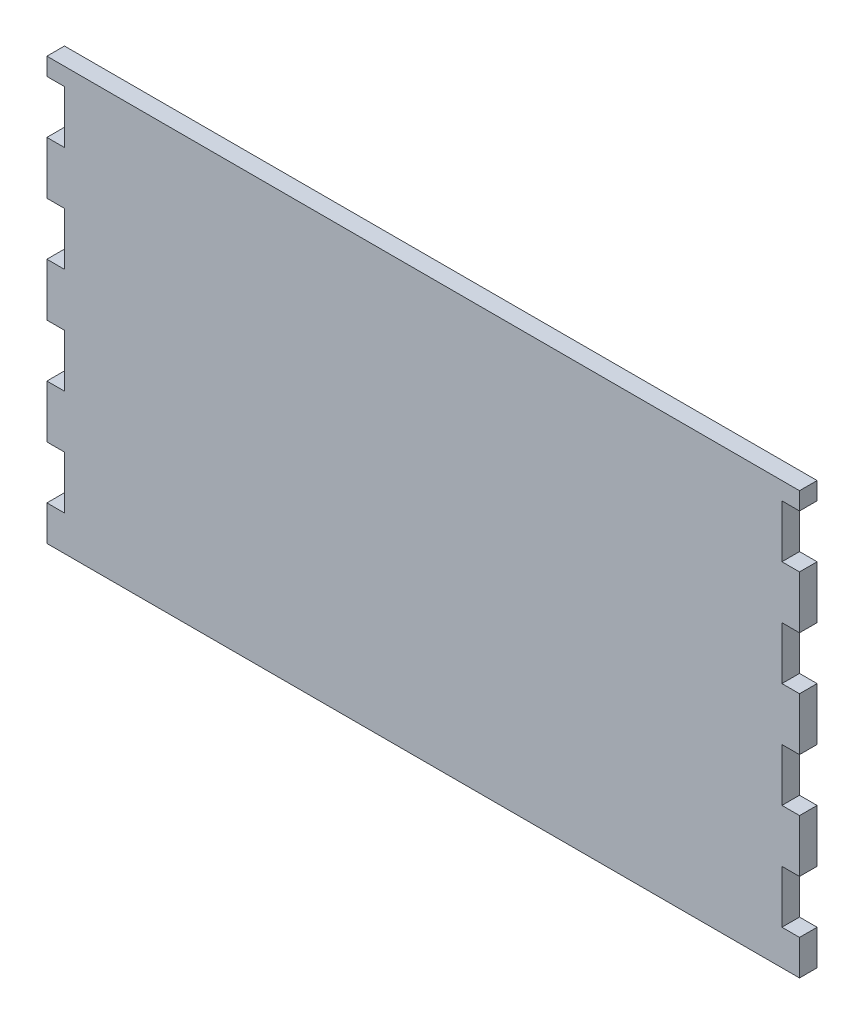
ISO-10303-21;
HEADER;
FILE_DESCRIPTION(('STEP AP214'),'2;1');
FILE_NAME('part.step','',(''),(''),'','','');
FILE_SCHEMA(('AUTOMOTIVE_DESIGN { 1 0 10303 214 1 1 1 1 }'));
ENDSEC;
DATA;
#1=APPLICATION_CONTEXT('core data for automotive mechanical design processes');
#2=APPLICATION_PROTOCOL_DEFINITION('international standard','automotive_design',2000,#1);
#3=PRODUCT_CONTEXT('',#1,'mechanical');
#4=PRODUCT('Part','Part','',(#3));
#5=PRODUCT_RELATED_PRODUCT_CATEGORY('part','',(#4));
#6=PRODUCT_DEFINITION_FORMATION('','',#4);
#7=PRODUCT_DEFINITION_CONTEXT('part definition',#1,'design');
#8=PRODUCT_DEFINITION('design','',#6,#7);
#9=PRODUCT_DEFINITION_SHAPE('','',#8);
#10=(LENGTH_UNIT() NAMED_UNIT(*) SI_UNIT(.MILLI.,.METRE.));
#11=(NAMED_UNIT(*) PLANE_ANGLE_UNIT() SI_UNIT($,.RADIAN.));
#12=(NAMED_UNIT(*) SI_UNIT($,.STERADIAN.) SOLID_ANGLE_UNIT());
#13=UNCERTAINTY_MEASURE_WITH_UNIT(LENGTH_MEASURE(1.E-05),#10,'distance_accuracy_value','');
#14=(GEOMETRIC_REPRESENTATION_CONTEXT(3) GLOBAL_UNCERTAINTY_ASSIGNED_CONTEXT((#13)) GLOBAL_UNIT_ASSIGNED_CONTEXT((#10,
#11,#12)) REPRESENTATION_CONTEXT('',''));
#15=CARTESIAN_POINT('',(0.,0.,0.));
#16=DIRECTION('',(0.,0.,1.));
#17=DIRECTION('',(1.,0.,0.));
#18=AXIS2_PLACEMENT_3D('',#15,#16,#17);
#19=CARTESIAN_POINT('',(135.889999999999,-76.1999999999998,6.35));
#20=DIRECTION('',(-1.,0.,0.));
#21=DIRECTION('',(0.,0.,1.));
#22=AXIS2_PLACEMENT_3D('',#19,#20,#21);
#23=PLANE('',#22);
#24=DIRECTION('',(0.,0.,1.));
#25=VECTOR('',#24,1.);
#26=CARTESIAN_POINT('',(135.890000000001,50.8000000000002,0.));
#27=LINE('',#26,#25);
#28=CARTESIAN_POINT('',(135.890000000001,50.8000000000002,0.));
#29=VERTEX_POINT('',#28);
#30=CARTESIAN_POINT('',(135.890000000001,50.8000000000002,6.35));
#31=VERTEX_POINT('',#30);
#32=EDGE_CURVE('E466',#29,#31,#27,.T.);
#33=ORIENTED_EDGE('',*,*,#32,.T.);
#34=DIRECTION('',(0.,1.,0.));
#35=VECTOR('',#34,1.);
#36=CARTESIAN_POINT('',(135.889999999999,-76.1999999999998,6.35));
#37=LINE('',#36,#35);
#38=CARTESIAN_POINT('',(135.890000000001,31.7500000000002,6.35));
#39=VERTEX_POINT('',#38);
#40=EDGE_CURVE('E606',#39,#31,#37,.T.);
#41=ORIENTED_EDGE('',*,*,#40,.F.);
#42=DIRECTION('',(0.,0.,1.));
#43=VECTOR('',#42,1.);
#44=CARTESIAN_POINT('',(135.890000000001,31.7500000000002,0.));
#45=LINE('',#44,#43);
#46=CARTESIAN_POINT('',(135.890000000001,31.7500000000002,0.));
#47=VERTEX_POINT('',#46);
#48=EDGE_CURVE('E330',#47,#39,#45,.T.);
#49=ORIENTED_EDGE('',*,*,#48,.F.);
#50=DIRECTION('',(0.,1.,0.));
#51=VECTOR('',#50,1.);
#52=CARTESIAN_POINT('',(135.889999999999,-76.1999999999998,0.));
#53=LINE('',#52,#51);
#54=EDGE_CURVE('E289',#47,#29,#53,.T.);
#55=ORIENTED_EDGE('',*,*,#54,.T.);
#56=EDGE_LOOP('',(#33,#41,#49,#55));
#57=FACE_BOUND('',#56,.T.);
#58=ADVANCED_FACE('F33',(#57),#23,.F.);
#59=DIRECTION('',(0.,0.,1.));
#60=VECTOR('',#59,1.);
#61=CARTESIAN_POINT('',(135.890000000001,69.8500000000002,0.));
#62=LINE('',#61,#60);
#63=CARTESIAN_POINT('',(135.890000000001,69.8500000000002,0.));
#64=VERTEX_POINT('',#63);
#65=CARTESIAN_POINT('',(135.890000000001,69.8500000000002,6.35));
#66=VERTEX_POINT('',#65);
#67=EDGE_CURVE('E267',#64,#66,#62,.T.);
#68=ORIENTED_EDGE('',*,*,#67,.F.);
#69=CARTESIAN_POINT('',(135.889999999999,76.2000000000002,0.));
#70=VERTEX_POINT('',#69);
#71=EDGE_CURVE('E279',#64,#70,#53,.T.);
#72=ORIENTED_EDGE('',*,*,#71,.T.);
#73=DIRECTION('',(0.,0.,-1.));
#74=VECTOR('',#73,1.);
#75=CARTESIAN_POINT('',(135.889999999999,76.2000000000002,6.35));
#76=LINE('',#75,#74);
#77=CARTESIAN_POINT('',(135.889999999999,76.2000000000002,6.35));
#78=VERTEX_POINT('',#77);
#79=EDGE_CURVE('E612',#78,#70,#76,.T.);
#80=ORIENTED_EDGE('',*,*,#79,.F.);
#81=EDGE_CURVE('E281',#66,#78,#37,.T.);
#82=ORIENTED_EDGE('',*,*,#81,.F.);
#83=EDGE_LOOP('',(#68,#72,#80,#82));
#84=FACE_BOUND('',#83,.T.);
#85=ADVANCED_FACE('F277',(#84),#23,.F.);
#86=DIRECTION('',(0.,0.,1.));
#87=VECTOR('',#86,1.);
#88=CARTESIAN_POINT('',(135.890000000001,12.7000000000002,0.));
#89=LINE('',#88,#87);
#90=CARTESIAN_POINT('',(135.890000000001,12.7000000000002,0.));
#91=VERTEX_POINT('',#90);
#92=CARTESIAN_POINT('',(135.890000000001,12.7000000000002,6.35));
#93=VERTEX_POINT('',#92);
#94=EDGE_CURVE('E317',#91,#93,#89,.T.);
#95=ORIENTED_EDGE('',*,*,#94,.T.);
#96=CARTESIAN_POINT('',(135.890000000001,-6.3499999999998,6.35));
#97=VERTEX_POINT('',#96);
#98=EDGE_CURVE('E605',#97,#93,#37,.T.);
#99=ORIENTED_EDGE('',*,*,#98,.F.);
#100=DIRECTION('',(0.,0.,1.));
#101=VECTOR('',#100,1.);
#102=CARTESIAN_POINT('',(135.890000000001,-6.3499999999998,0.));
#103=LINE('',#102,#101);
#104=CARTESIAN_POINT('',(135.890000000001,-6.3499999999998,0.));
#105=VERTEX_POINT('',#104);
#106=EDGE_CURVE('E319',#105,#97,#103,.T.);
#107=ORIENTED_EDGE('',*,*,#106,.F.);
#108=EDGE_CURVE('E294',#105,#91,#53,.T.);
#109=ORIENTED_EDGE('',*,*,#108,.T.);
#110=EDGE_LOOP('',(#95,#99,#107,#109));
#111=FACE_BOUND('',#110,.T.);
#112=ADVANCED_FACE('F315',(#111),#23,.F.);
#113=DIRECTION('',(0.,0.,1.));
#114=VECTOR('',#113,1.);
#115=CARTESIAN_POINT('',(135.890000000001,-25.3999999999998,0.));
#116=LINE('',#115,#114);
#117=CARTESIAN_POINT('',(135.890000000001,-25.3999999999998,0.));
#118=VERTEX_POINT('',#117);
#119=CARTESIAN_POINT('',(135.890000000001,-25.3999999999998,6.35));
#120=VERTEX_POINT('',#119);
#121=EDGE_CURVE('E341',#118,#120,#116,.T.);
#122=ORIENTED_EDGE('',*,*,#121,.T.);
#123=CARTESIAN_POINT('',(135.890000000001,-44.4499999999998,6.35));
#124=VERTEX_POINT('',#123);
#125=EDGE_CURVE('E513',#124,#120,#37,.T.);
#126=ORIENTED_EDGE('',*,*,#125,.F.);
#127=DIRECTION('',(0.,0.,1.));
#128=VECTOR('',#127,1.);
#129=CARTESIAN_POINT('',(135.890000000001,-44.4499999999998,0.));
#130=LINE('',#129,#128);
#131=CARTESIAN_POINT('',(135.890000000001,-44.4499999999998,0.));
#132=VERTEX_POINT('',#131);
#133=EDGE_CURVE('E382',#132,#124,#130,.T.);
#134=ORIENTED_EDGE('',*,*,#133,.F.);
#135=EDGE_CURVE('E299',#132,#118,#53,.T.);
#136=ORIENTED_EDGE('',*,*,#135,.T.);
#137=EDGE_LOOP('',(#122,#126,#134,#136));
#138=FACE_BOUND('',#137,.T.);
#139=ADVANCED_FACE('F585',(#138),#23,.F.);
#140=DIRECTION('',(0.,0.,1.));
#141=VECTOR('',#140,1.);
#142=CARTESIAN_POINT('',(135.890000000001,-63.4999999999998,0.));
#143=LINE('',#142,#141);
#144=CARTESIAN_POINT('',(135.890000000001,-63.4999999999998,0.));
#145=VERTEX_POINT('',#144);
#146=CARTESIAN_POINT('',(135.890000000001,-63.4999999999998,6.35));
#147=VERTEX_POINT('',#146);
#148=EDGE_CURVE('E363',#145,#147,#143,.T.);
#149=ORIENTED_EDGE('',*,*,#148,.T.);
#150=CARTESIAN_POINT('',(135.889999999999,-76.1999999999998,6.35));
#151=VERTEX_POINT('',#150);
#152=EDGE_CURVE('E509',#151,#147,#37,.T.);
#153=ORIENTED_EDGE('',*,*,#152,.F.);
#154=DIRECTION('',(0.,0.,-1.));
#155=VECTOR('',#154,1.);
#156=CARTESIAN_POINT('',(135.889999999999,-76.1999999999998,6.35));
#157=LINE('',#156,#155);
#158=CARTESIAN_POINT('',(135.889999999999,-76.1999999999998,0.));
#159=VERTEX_POINT('',#158);
#160=EDGE_CURVE('E41',#151,#159,#157,.T.);
#161=ORIENTED_EDGE('',*,*,#160,.T.);
#162=EDGE_CURVE('E292',#159,#145,#53,.T.);
#163=ORIENTED_EDGE('',*,*,#162,.T.);
#164=EDGE_LOOP('',(#149,#153,#161,#163));
#165=FACE_BOUND('',#164,.T.);
#166=ADVANCED_FACE('F578',(#165),#23,.F.);
#167=CARTESIAN_POINT('',(0.,0.,6.35));
#168=DIRECTION('',(0.,0.,1.));
#169=DIRECTION('',(1.,0.,0.));
#170=AXIS2_PLACEMENT_3D('',#167,#168,#169);
#171=PLANE('',#170);
#172=ORIENTED_EDGE('',*,*,#40,.T.);
#173=DIRECTION('',(-1.,0.,0.));
#174=VECTOR('',#173,1.);
#175=CARTESIAN_POINT('',(135.890000000001,50.8000000000002,6.35));
#176=LINE('',#175,#174);
#177=CARTESIAN_POINT('',(129.540000000001,50.8000000000002,6.35));
#178=VERTEX_POINT('',#177);
#179=EDGE_CURVE('E273',#31,#178,#176,.T.);
#180=ORIENTED_EDGE('',*,*,#179,.T.);
#181=DIRECTION('',(0.,1.,0.));
#182=VECTOR('',#181,1.);
#183=CARTESIAN_POINT('',(129.540000000001,69.8500000000002,6.35));
#184=LINE('',#183,#182);
#185=CARTESIAN_POINT('',(129.540000000001,69.8500000000002,6.35));
#186=VERTEX_POINT('',#185);
#187=EDGE_CURVE('E888',#178,#186,#184,.T.);
#188=ORIENTED_EDGE('',*,*,#187,.T.);
#189=DIRECTION('',(1.,0.,0.));
#190=VECTOR('',#189,1.);
#191=CARTESIAN_POINT('',(135.890000000001,69.8500000000002,6.35));
#192=LINE('',#191,#190);
#193=EDGE_CURVE('E348',#186,#66,#192,.T.);
#194=ORIENTED_EDGE('',*,*,#193,.T.);
#195=ORIENTED_EDGE('',*,*,#81,.T.);
#196=DIRECTION('',(-1.,0.,0.));
#197=VECTOR('',#196,1.);
#198=CARTESIAN_POINT('',(135.889999999999,76.2000000000002,6.35));
#199=LINE('',#198,#197);
#200=CARTESIAN_POINT('',(-135.890000000001,76.2000000000002,6.35));
#201=VERTEX_POINT('',#200);
#202=EDGE_CURVE('E512',#78,#201,#199,.T.);
#203=ORIENTED_EDGE('',*,*,#202,.T.);
#204=DIRECTION('',(0.,-1.,0.));
#205=VECTOR('',#204,1.);
#206=CARTESIAN_POINT('',(-135.890000000001,-76.1999999999998,6.35));
#207=LINE('',#206,#205);
#208=CARTESIAN_POINT('',(-135.890000000001,69.8500000000002,6.35));
#209=VERTEX_POINT('',#208);
#210=EDGE_CURVE('E503',#201,#209,#207,.T.);
#211=ORIENTED_EDGE('',*,*,#210,.T.);
#212=DIRECTION('',(-1.,0.,0.));
#213=VECTOR('',#212,1.);
#214=CARTESIAN_POINT('',(-135.890000000001,69.8500000000002,6.35));
#215=LINE('',#214,#213);
#216=CARTESIAN_POINT('',(-129.540000000001,69.8500000000002,6.35));
#217=VERTEX_POINT('',#216);
#218=EDGE_CURVE('E481',#217,#209,#215,.T.);
#219=ORIENTED_EDGE('',*,*,#218,.F.);
#220=DIRECTION('',(0.,1.,0.));
#221=VECTOR('',#220,1.);
#222=CARTESIAN_POINT('',(-129.540000000001,69.8500000000002,6.35));
#223=LINE('',#222,#221);
#224=CARTESIAN_POINT('',(-129.540000000001,50.8000000000002,6.35));
#225=VERTEX_POINT('',#224);
#226=EDGE_CURVE('E490',#225,#217,#223,.T.);
#227=ORIENTED_EDGE('',*,*,#226,.F.);
#228=DIRECTION('',(1.,0.,0.));
#229=VECTOR('',#228,1.);
#230=CARTESIAN_POINT('',(-135.890000000001,50.8000000000002,6.35));
#231=LINE('',#230,#229);
#232=CARTESIAN_POINT('',(-135.890000000001,50.8000000000002,6.35));
#233=VERTEX_POINT('',#232);
#234=EDGE_CURVE('E419',#233,#225,#231,.T.);
#235=ORIENTED_EDGE('',*,*,#234,.F.);
#236=CARTESIAN_POINT('',(-135.890000000001,31.7500000000002,6.35));
#237=VERTEX_POINT('',#236);
#238=EDGE_CURVE('E507',#233,#237,#207,.T.);
#239=ORIENTED_EDGE('',*,*,#238,.T.);
#240=DIRECTION('',(-1.,0.,0.));
#241=VECTOR('',#240,1.);
#242=CARTESIAN_POINT('',(-135.890000000001,31.7500000000002,6.35));
#243=LINE('',#242,#241);
#244=CARTESIAN_POINT('',(-129.540000000001,31.7500000000002,6.35));
#245=VERTEX_POINT('',#244);
#246=EDGE_CURVE('E401',#245,#237,#243,.T.);
#247=ORIENTED_EDGE('',*,*,#246,.F.);
#248=DIRECTION('',(0.,1.,0.));
#249=VECTOR('',#248,1.);
#250=CARTESIAN_POINT('',(-129.540000000001,31.7500000000002,6.35));
#251=LINE('',#250,#249);
#252=CARTESIAN_POINT('',(-129.540000000001,12.7000000000002,6.35));
#253=VERTEX_POINT('',#252);
#254=EDGE_CURVE('E411',#253,#245,#251,.T.);
#255=ORIENTED_EDGE('',*,*,#254,.F.);
#256=DIRECTION('',(1.,0.,0.));
#257=VECTOR('',#256,1.);
#258=CARTESIAN_POINT('',(-135.890000000001,12.7000000000002,6.35));
#259=LINE('',#258,#257);
#260=CARTESIAN_POINT('',(-135.890000000001,12.7000000000002,6.35));
#261=VERTEX_POINT('',#260);
#262=EDGE_CURVE('E408',#261,#253,#259,.T.);
#263=ORIENTED_EDGE('',*,*,#262,.F.);
#264=CARTESIAN_POINT('',(-135.890000000001,-6.3499999999998,6.35));
#265=VERTEX_POINT('',#264);
#266=EDGE_CURVE('E549',#261,#265,#207,.T.);
#267=ORIENTED_EDGE('',*,*,#266,.T.);
#268=DIRECTION('',(-1.,0.,0.));
#269=VECTOR('',#268,1.);
#270=CARTESIAN_POINT('',(-135.890000000001,-6.3499999999998,6.35));
#271=LINE('',#270,#269);
#272=CARTESIAN_POINT('',(-129.540000000001,-6.3499999999998,6.35));
#273=VERTEX_POINT('',#272);
#274=EDGE_CURVE('E429',#273,#265,#271,.T.);
#275=ORIENTED_EDGE('',*,*,#274,.F.);
#276=DIRECTION('',(0.,1.,0.));
#277=VECTOR('',#276,1.);
#278=CARTESIAN_POINT('',(-129.540000000001,-6.3499999999998,6.35));
#279=LINE('',#278,#277);
#280=CARTESIAN_POINT('',(-129.540000000001,-25.3999999999998,6.35));
#281=VERTEX_POINT('',#280);
#282=EDGE_CURVE('E439',#281,#273,#279,.T.);
#283=ORIENTED_EDGE('',*,*,#282,.F.);
#284=DIRECTION('',(1.,0.,0.));
#285=VECTOR('',#284,1.);
#286=CARTESIAN_POINT('',(-135.890000000001,-25.3999999999998,6.35));
#287=LINE('',#286,#285);
#288=CARTESIAN_POINT('',(-135.890000000001,-25.3999999999998,6.35));
#289=VERTEX_POINT('',#288);
#290=EDGE_CURVE('E436',#289,#281,#287,.T.);
#291=ORIENTED_EDGE('',*,*,#290,.F.);
#292=CARTESIAN_POINT('',(-135.890000000001,-44.4499999999998,6.35));
#293=VERTEX_POINT('',#292);
#294=EDGE_CURVE('E551',#289,#293,#207,.T.);
#295=ORIENTED_EDGE('',*,*,#294,.T.);
#296=DIRECTION('',(-1.,0.,0.));
#297=VECTOR('',#296,1.);
#298=CARTESIAN_POINT('',(-135.890000000001,-44.4499999999998,6.35));
#299=LINE('',#298,#297);
#300=CARTESIAN_POINT('',(-129.540000000001,-44.4499999999998,6.35));
#301=VERTEX_POINT('',#300);
#302=EDGE_CURVE('E455',#301,#293,#299,.T.);
#303=ORIENTED_EDGE('',*,*,#302,.F.);
#304=DIRECTION('',(0.,1.,0.));
#305=VECTOR('',#304,1.);
#306=CARTESIAN_POINT('',(-129.540000000001,-44.4499999999998,6.35));
#307=LINE('',#306,#305);
#308=CARTESIAN_POINT('',(-129.540000000001,-63.4999999999998,6.35));
#309=VERTEX_POINT('',#308);
#310=EDGE_CURVE('E465',#309,#301,#307,.T.);
#311=ORIENTED_EDGE('',*,*,#310,.F.);
#312=DIRECTION('',(1.,0.,0.));
#313=VECTOR('',#312,1.);
#314=CARTESIAN_POINT('',(-135.890000000001,-63.4999999999998,6.35));
#315=LINE('',#314,#313);
#316=CARTESIAN_POINT('',(-135.890000000001,-63.4999999999998,6.35));
#317=VERTEX_POINT('',#316);
#318=EDGE_CURVE('E462',#317,#309,#315,.T.);
#319=ORIENTED_EDGE('',*,*,#318,.F.);
#320=CARTESIAN_POINT('',(-135.890000000001,-76.1999999999998,6.35));
#321=VERTEX_POINT('',#320);
#322=EDGE_CURVE('E304',#317,#321,#207,.T.);
#323=ORIENTED_EDGE('',*,*,#322,.T.);
#324=DIRECTION('',(1.,0.,0.));
#325=VECTOR('',#324,1.);
#326=CARTESIAN_POINT('',(135.889999999999,-76.1999999999998,6.35));
#327=LINE('',#326,#325);
#328=EDGE_CURVE('E506',#321,#151,#327,.T.);
#329=ORIENTED_EDGE('',*,*,#328,.T.);
#330=ORIENTED_EDGE('',*,*,#152,.T.);
#331=DIRECTION('',(-1.,0.,0.));
#332=VECTOR('',#331,1.);
#333=CARTESIAN_POINT('',(135.890000000001,-63.4999999999998,6.35));
#334=LINE('',#333,#332);
#335=CARTESIAN_POINT('',(129.540000000001,-63.4999999999998,6.35));
#336=VERTEX_POINT('',#335);
#337=EDGE_CURVE('E377',#147,#336,#334,.T.);
#338=ORIENTED_EDGE('',*,*,#337,.T.);
#339=DIRECTION('',(0.,1.,0.));
#340=VECTOR('',#339,1.);
#341=CARTESIAN_POINT('',(129.540000000001,-44.4499999999998,6.35));
#342=LINE('',#341,#340);
#343=CARTESIAN_POINT('',(129.540000000001,-44.4499999999998,6.35));
#344=VERTEX_POINT('',#343);
#345=EDGE_CURVE('E386',#336,#344,#342,.T.);
#346=ORIENTED_EDGE('',*,*,#345,.T.);
#347=DIRECTION('',(1.,0.,0.));
#348=VECTOR('',#347,1.);
#349=CARTESIAN_POINT('',(135.890000000001,-44.4499999999998,6.35));
#350=LINE('',#349,#348);
#351=EDGE_CURVE('E383',#344,#124,#350,.T.);
#352=ORIENTED_EDGE('',*,*,#351,.T.);
#353=ORIENTED_EDGE('',*,*,#125,.T.);
#354=DIRECTION('',(-1.,0.,0.));
#355=VECTOR('',#354,1.);
#356=CARTESIAN_POINT('',(135.890000000001,-25.3999999999998,6.35));
#357=LINE('',#356,#355);
#358=CARTESIAN_POINT('',(129.540000000001,-25.3999999999998,6.35));
#359=VERTEX_POINT('',#358);
#360=EDGE_CURVE('E354',#120,#359,#357,.T.);
#361=ORIENTED_EDGE('',*,*,#360,.T.);
#362=DIRECTION('',(0.,1.,0.));
#363=VECTOR('',#362,1.);
#364=CARTESIAN_POINT('',(129.540000000001,-6.3499999999998,6.35));
#365=LINE('',#364,#363);
#366=CARTESIAN_POINT('',(129.540000000001,-6.3499999999998,6.35));
#367=VERTEX_POINT('',#366);
#368=EDGE_CURVE('E362',#359,#367,#365,.T.);
#369=ORIENTED_EDGE('',*,*,#368,.T.);
#370=DIRECTION('',(1.,0.,0.));
#371=VECTOR('',#370,1.);
#372=CARTESIAN_POINT('',(135.890000000001,-6.3499999999998,6.35));
#373=LINE('',#372,#371);
#374=EDGE_CURVE('E359',#367,#97,#373,.T.);
#375=ORIENTED_EDGE('',*,*,#374,.T.);
#376=ORIENTED_EDGE('',*,*,#98,.T.);
#377=DIRECTION('',(-1.,0.,0.));
#378=VECTOR('',#377,1.);
#379=CARTESIAN_POINT('',(135.890000000001,12.7000000000002,6.35));
#380=LINE('',#379,#378);
#381=CARTESIAN_POINT('',(129.540000000001,12.7000000000002,6.35));
#382=VERTEX_POINT('',#381);
#383=EDGE_CURVE('E344',#93,#382,#380,.T.);
#384=ORIENTED_EDGE('',*,*,#383,.T.);
#385=DIRECTION('',(0.,1.,0.));
#386=VECTOR('',#385,1.);
#387=CARTESIAN_POINT('',(129.540000000001,31.7500000000002,6.35));
#388=LINE('',#387,#386);
#389=CARTESIAN_POINT('',(129.540000000001,31.7500000000002,6.35));
#390=VERTEX_POINT('',#389);
#391=EDGE_CURVE('E340',#382,#390,#388,.T.);
#392=ORIENTED_EDGE('',*,*,#391,.T.);
#393=DIRECTION('',(1.,0.,0.));
#394=VECTOR('',#393,1.);
#395=CARTESIAN_POINT('',(135.890000000001,31.7500000000002,6.35));
#396=LINE('',#395,#394);
#397=EDGE_CURVE('E337',#390,#39,#396,.T.);
#398=ORIENTED_EDGE('',*,*,#397,.T.);
#399=EDGE_LOOP('',(#172,#180,#188,#194,#195,#203,#211,#219,#227,#235,#239,#247,#255,#263,#267,
#275,#283,#291,#295,#303,#311,#319,#323,#329,#330,#338,#346,#352,#353,#361,#369,#375,#376,#384,
#392,#398));
#400=FACE_BOUND('',#399,.T.);
#401=ADVANCED_FACE('F546',(#400),#171,.T.);
#402=CARTESIAN_POINT('',(0.,0.,0.));
#403=DIRECTION('',(0.,0.,1.));
#404=DIRECTION('',(1.,0.,0.));
#405=AXIS2_PLACEMENT_3D('',#402,#403,#404);
#406=PLANE('',#405);
#407=DIRECTION('',(-1.,0.,0.));
#408=VECTOR('',#407,1.);
#409=CARTESIAN_POINT('',(135.890000000001,50.8000000000002,0.));
#410=LINE('',#409,#408);
#411=CARTESIAN_POINT('',(129.540000000001,50.8000000000002,0.));
#412=VERTEX_POINT('',#411);
#413=EDGE_CURVE('E282',#29,#412,#410,.T.);
#414=ORIENTED_EDGE('',*,*,#413,.F.);
#415=ORIENTED_EDGE('',*,*,#54,.F.);
#416=DIRECTION('',(1.,0.,0.));
#417=VECTOR('',#416,1.);
#418=CARTESIAN_POINT('',(135.890000000001,31.7500000000002,0.));
#419=LINE('',#418,#417);
#420=CARTESIAN_POINT('',(129.540000000001,31.7500000000002,0.));
#421=VERTEX_POINT('',#420);
#422=EDGE_CURVE('E333',#421,#47,#419,.T.);
#423=ORIENTED_EDGE('',*,*,#422,.F.);
#424=DIRECTION('',(0.,1.,0.));
#425=VECTOR('',#424,1.);
#426=CARTESIAN_POINT('',(129.540000000001,31.7500000000002,0.));
#427=LINE('',#426,#425);
#428=CARTESIAN_POINT('',(129.540000000001,12.7000000000002,0.));
#429=VERTEX_POINT('',#428);
#430=EDGE_CURVE('E327',#429,#421,#427,.T.);
#431=ORIENTED_EDGE('',*,*,#430,.F.);
#432=DIRECTION('',(-1.,0.,0.));
#433=VECTOR('',#432,1.);
#434=CARTESIAN_POINT('',(135.890000000001,12.7000000000002,0.));
#435=LINE('',#434,#433);
#436=EDGE_CURVE('E325',#91,#429,#435,.T.);
#437=ORIENTED_EDGE('',*,*,#436,.F.);
#438=ORIENTED_EDGE('',*,*,#108,.F.);
#439=DIRECTION('',(1.,0.,0.));
#440=VECTOR('',#439,1.);
#441=CARTESIAN_POINT('',(135.890000000001,-6.3499999999998,0.));
#442=LINE('',#441,#440);
#443=CARTESIAN_POINT('',(129.540000000001,-6.3499999999998,0.));
#444=VERTEX_POINT('',#443);
#445=EDGE_CURVE('E323',#444,#105,#442,.T.);
#446=ORIENTED_EDGE('',*,*,#445,.F.);
#447=DIRECTION('',(0.,1.,0.));
#448=VECTOR('',#447,1.);
#449=CARTESIAN_POINT('',(129.540000000001,-6.3499999999998,0.));
#450=LINE('',#449,#448);
#451=CARTESIAN_POINT('',(129.540000000001,-25.3999999999998,0.));
#452=VERTEX_POINT('',#451);
#453=EDGE_CURVE('E353',#452,#444,#450,.T.);
#454=ORIENTED_EDGE('',*,*,#453,.F.);
#455=DIRECTION('',(-1.,0.,0.));
#456=VECTOR('',#455,1.);
#457=CARTESIAN_POINT('',(135.890000000001,-25.3999999999998,0.));
#458=LINE('',#457,#456);
#459=EDGE_CURVE('E357',#118,#452,#458,.T.);
#460=ORIENTED_EDGE('',*,*,#459,.F.);
#461=ORIENTED_EDGE('',*,*,#135,.F.);
#462=DIRECTION('',(1.,0.,0.));
#463=VECTOR('',#462,1.);
#464=CARTESIAN_POINT('',(135.890000000001,-44.4499999999998,0.));
#465=LINE('',#464,#463);
#466=CARTESIAN_POINT('',(129.540000000001,-44.4499999999998,0.));
#467=VERTEX_POINT('',#466);
#468=EDGE_CURVE('E374',#467,#132,#465,.T.);
#469=ORIENTED_EDGE('',*,*,#468,.F.);
#470=DIRECTION('',(0.,1.,0.));
#471=VECTOR('',#470,1.);
#472=CARTESIAN_POINT('',(129.540000000001,-44.4499999999998,0.));
#473=LINE('',#472,#471);
#474=CARTESIAN_POINT('',(129.540000000001,-63.4999999999998,0.));
#475=VERTEX_POINT('',#474);
#476=EDGE_CURVE('E376',#475,#467,#473,.T.);
#477=ORIENTED_EDGE('',*,*,#476,.F.);
#478=DIRECTION('',(-1.,0.,0.));
#479=VECTOR('',#478,1.);
#480=CARTESIAN_POINT('',(135.890000000001,-63.4999999999998,0.));
#481=LINE('',#480,#479);
#482=EDGE_CURVE('E380',#145,#475,#481,.T.);
#483=ORIENTED_EDGE('',*,*,#482,.F.);
#484=ORIENTED_EDGE('',*,*,#162,.F.);
#485=DIRECTION('',(1.,0.,0.));
#486=VECTOR('',#485,1.);
#487=CARTESIAN_POINT('',(135.889999999999,-76.1999999999998,0.));
#488=LINE('',#487,#486);
#489=CARTESIAN_POINT('',(-135.890000000001,-76.1999999999998,0.));
#490=VERTEX_POINT('',#489);
#491=EDGE_CURVE('E290',#490,#159,#488,.T.);
#492=ORIENTED_EDGE('',*,*,#491,.F.);
#493=DIRECTION('',(0.,-1.,0.));
#494=VECTOR('',#493,1.);
#495=CARTESIAN_POINT('',(-135.890000000001,-76.1999999999998,0.));
#496=LINE('',#495,#494);
#497=CARTESIAN_POINT('',(-135.890000000001,-63.4999999999998,0.));
#498=VERTEX_POINT('',#497);
#499=EDGE_CURVE('E497',#498,#490,#496,.T.);
#500=ORIENTED_EDGE('',*,*,#499,.F.);
#501=DIRECTION('',(1.,0.,0.));
#502=VECTOR('',#501,1.);
#503=CARTESIAN_POINT('',(-135.890000000001,-63.4999999999998,0.));
#504=LINE('',#503,#502);
#505=CARTESIAN_POINT('',(-129.540000000001,-63.4999999999998,0.));
#506=VERTEX_POINT('',#505);
#507=EDGE_CURVE('E451',#498,#506,#504,.T.);
#508=ORIENTED_EDGE('',*,*,#507,.T.);
#509=DIRECTION('',(0.,1.,0.));
#510=VECTOR('',#509,1.);
#511=CARTESIAN_POINT('',(-129.540000000001,-44.4499999999998,0.));
#512=LINE('',#511,#510);
#513=CARTESIAN_POINT('',(-129.540000000001,-44.4499999999998,0.));
#514=VERTEX_POINT('',#513);
#515=EDGE_CURVE('E454',#506,#514,#512,.T.);
#516=ORIENTED_EDGE('',*,*,#515,.T.);
#517=DIRECTION('',(-1.,0.,0.));
#518=VECTOR('',#517,1.);
#519=CARTESIAN_POINT('',(-135.890000000001,-44.4499999999998,0.));
#520=LINE('',#519,#518);
#521=CARTESIAN_POINT('',(-135.890000000001,-44.4499999999998,0.));
#522=VERTEX_POINT('',#521);
#523=EDGE_CURVE('E458',#514,#522,#520,.T.);
#524=ORIENTED_EDGE('',*,*,#523,.T.);
#525=CARTESIAN_POINT('',(-135.890000000001,-25.3999999999998,0.));
#526=VERTEX_POINT('',#525);
#527=EDGE_CURVE('E522',#526,#522,#496,.T.);
#528=ORIENTED_EDGE('',*,*,#527,.F.);
#529=DIRECTION('',(1.,0.,0.));
#530=VECTOR('',#529,1.);
#531=CARTESIAN_POINT('',(-135.890000000001,-25.3999999999998,0.));
#532=LINE('',#531,#530);
#533=CARTESIAN_POINT('',(-129.540000000001,-25.3999999999998,0.));
#534=VERTEX_POINT('',#533);
#535=EDGE_CURVE('E425',#526,#534,#532,.T.);
#536=ORIENTED_EDGE('',*,*,#535,.T.);
#537=DIRECTION('',(0.,1.,0.));
#538=VECTOR('',#537,1.);
#539=CARTESIAN_POINT('',(-129.540000000001,-6.3499999999998,0.));
#540=LINE('',#539,#538);
#541=CARTESIAN_POINT('',(-129.540000000001,-6.3499999999998,0.));
#542=VERTEX_POINT('',#541);
#543=EDGE_CURVE('E428',#534,#542,#540,.T.);
#544=ORIENTED_EDGE('',*,*,#543,.T.);
#545=DIRECTION('',(-1.,0.,0.));
#546=VECTOR('',#545,1.);
#547=CARTESIAN_POINT('',(-135.890000000001,-6.3499999999998,0.));
#548=LINE('',#547,#546);
#549=CARTESIAN_POINT('',(-135.890000000001,-6.3499999999998,0.));
#550=VERTEX_POINT('',#549);
#551=EDGE_CURVE('E432',#542,#550,#548,.T.);
#552=ORIENTED_EDGE('',*,*,#551,.T.);
#553=CARTESIAN_POINT('',(-135.890000000001,12.7000000000002,0.));
#554=VERTEX_POINT('',#553);
#555=EDGE_CURVE('E521',#554,#550,#496,.T.);
#556=ORIENTED_EDGE('',*,*,#555,.F.);
#557=DIRECTION('',(1.,0.,0.));
#558=VECTOR('',#557,1.);
#559=CARTESIAN_POINT('',(-135.890000000001,12.7000000000002,0.));
#560=LINE('',#559,#558);
#561=CARTESIAN_POINT('',(-129.540000000001,12.7000000000002,0.));
#562=VERTEX_POINT('',#561);
#563=EDGE_CURVE('E397',#554,#562,#560,.T.);
#564=ORIENTED_EDGE('',*,*,#563,.T.);
#565=DIRECTION('',(0.,1.,0.));
#566=VECTOR('',#565,1.);
#567=CARTESIAN_POINT('',(-129.540000000001,31.7500000000002,0.));
#568=LINE('',#567,#566);
#569=CARTESIAN_POINT('',(-129.540000000001,31.7500000000002,0.));
#570=VERTEX_POINT('',#569);
#571=EDGE_CURVE('E400',#562,#570,#568,.T.);
#572=ORIENTED_EDGE('',*,*,#571,.T.);
#573=DIRECTION('',(-1.,0.,0.));
#574=VECTOR('',#573,1.);
#575=CARTESIAN_POINT('',(-135.890000000001,31.7500000000002,0.));
#576=LINE('',#575,#574);
#577=CARTESIAN_POINT('',(-135.890000000001,31.7500000000002,0.));
#578=VERTEX_POINT('',#577);
#579=EDGE_CURVE('E404',#570,#578,#576,.T.);
#580=ORIENTED_EDGE('',*,*,#579,.T.);
#581=CARTESIAN_POINT('',(-135.890000000001,50.8000000000002,0.));
#582=VERTEX_POINT('',#581);
#583=EDGE_CURVE('E517',#582,#578,#496,.T.);
#584=ORIENTED_EDGE('',*,*,#583,.F.);
#585=DIRECTION('',(1.,0.,0.));
#586=VECTOR('',#585,1.);
#587=CARTESIAN_POINT('',(-135.890000000001,50.8000000000002,0.));
#588=LINE('',#587,#586);
#589=CARTESIAN_POINT('',(-129.540000000001,50.8000000000002,0.));
#590=VERTEX_POINT('',#589);
#591=EDGE_CURVE('E477',#582,#590,#588,.T.);
#592=ORIENTED_EDGE('',*,*,#591,.T.);
#593=DIRECTION('',(0.,1.,0.));
#594=VECTOR('',#593,1.);
#595=CARTESIAN_POINT('',(-129.540000000001,69.8500000000002,0.));
#596=LINE('',#595,#594);
#597=CARTESIAN_POINT('',(-129.540000000001,69.8500000000002,0.));
#598=VERTEX_POINT('',#597);
#599=EDGE_CURVE('E480',#590,#598,#596,.T.);
#600=ORIENTED_EDGE('',*,*,#599,.T.);
#601=DIRECTION('',(-1.,0.,0.));
#602=VECTOR('',#601,1.);
#603=CARTESIAN_POINT('',(-135.890000000001,69.8500000000002,0.));
#604=LINE('',#603,#602);
#605=CARTESIAN_POINT('',(-135.890000000001,69.8500000000002,0.));
#606=VERTEX_POINT('',#605);
#607=EDGE_CURVE('E484',#598,#606,#604,.T.);
#608=ORIENTED_EDGE('',*,*,#607,.T.);
#609=CARTESIAN_POINT('',(-135.890000000001,76.2000000000002,0.));
#610=VERTEX_POINT('',#609);
#611=EDGE_CURVE('E295',#610,#606,#496,.T.);
#612=ORIENTED_EDGE('',*,*,#611,.F.);
#613=DIRECTION('',(-1.,0.,0.));
#614=VECTOR('',#613,1.);
#615=CARTESIAN_POINT('',(135.889999999999,76.2000000000002,0.));
#616=LINE('',#615,#614);
#617=EDGE_CURVE('E288',#70,#610,#616,.T.);
#618=ORIENTED_EDGE('',*,*,#617,.F.);
#619=ORIENTED_EDGE('',*,*,#71,.F.);
#620=DIRECTION('',(1.,0.,0.));
#621=VECTOR('',#620,1.);
#622=CARTESIAN_POINT('',(135.890000000001,69.8500000000002,0.));
#623=LINE('',#622,#621);
#624=CARTESIAN_POINT('',(129.540000000001,69.8500000000002,0.));
#625=VERTEX_POINT('',#624);
#626=EDGE_CURVE('E264',#625,#64,#623,.T.);
#627=ORIENTED_EDGE('',*,*,#626,.F.);
#628=DIRECTION('',(0.,1.,0.));
#629=VECTOR('',#628,1.);
#630=CARTESIAN_POINT('',(129.540000000001,69.8500000000002,0.));
#631=LINE('',#630,#629);
#632=EDGE_CURVE('E272',#412,#625,#631,.T.);
#633=ORIENTED_EDGE('',*,*,#632,.F.);
#634=EDGE_LOOP('',(#414,#415,#423,#431,#437,#438,#446,#454,#460,#461,#469,#477,#483,#484,#492,
#500,#508,#516,#524,#528,#536,#544,#552,#556,#564,#572,#580,#584,#592,#600,#608,#612,#618,#619,
#627,#633));
#635=FACE_BOUND('',#634,.T.);
#636=ADVANCED_FACE('F286',(#635),#406,.F.);
#637=CARTESIAN_POINT('',(-135.890000000001,-76.1999999999998,6.35));
#638=DIRECTION('',(1.,0.,0.));
#639=DIRECTION('',(0.,0.,-1.));
#640=AXIS2_PLACEMENT_3D('',#637,#638,#639);
#641=PLANE('',#640);
#642=ORIENTED_EDGE('',*,*,#583,.T.);
#643=DIRECTION('',(0.,0.,1.));
#644=VECTOR('',#643,1.);
#645=CARTESIAN_POINT('',(-135.890000000001,31.7500000000002,0.));
#646=LINE('',#645,#644);
#647=EDGE_CURVE('E416',#578,#237,#646,.T.);
#648=ORIENTED_EDGE('',*,*,#647,.T.);
#649=ORIENTED_EDGE('',*,*,#238,.F.);
#650=DIRECTION('',(0.,0.,1.));
#651=VECTOR('',#650,1.);
#652=CARTESIAN_POINT('',(-135.890000000001,50.8000000000002,0.));
#653=LINE('',#652,#651);
#654=EDGE_CURVE('E487',#582,#233,#653,.T.);
#655=ORIENTED_EDGE('',*,*,#654,.F.);
#656=EDGE_LOOP('',(#642,#648,#649,#655));
#657=FACE_BOUND('',#656,.T.);
#658=ADVANCED_FACE('F566',(#657),#641,.F.);
#659=ORIENTED_EDGE('',*,*,#266,.F.);
#660=DIRECTION('',(0.,0.,1.));
#661=VECTOR('',#660,1.);
#662=CARTESIAN_POINT('',(-135.890000000001,12.7000000000002,0.));
#663=LINE('',#662,#661);
#664=EDGE_CURVE('E407',#554,#261,#663,.T.);
#665=ORIENTED_EDGE('',*,*,#664,.F.);
#666=ORIENTED_EDGE('',*,*,#555,.T.);
#667=DIRECTION('',(0.,0.,1.));
#668=VECTOR('',#667,1.);
#669=CARTESIAN_POINT('',(-135.890000000001,-6.3499999999998,0.));
#670=LINE('',#669,#668);
#671=EDGE_CURVE('E412',#550,#265,#670,.T.);
#672=ORIENTED_EDGE('',*,*,#671,.T.);
#673=EDGE_LOOP('',(#659,#665,#666,#672));
#674=FACE_BOUND('',#673,.T.);
#675=ADVANCED_FACE('F537',(#674),#641,.F.);
#676=ORIENTED_EDGE('',*,*,#294,.F.);
#677=DIRECTION('',(0.,0.,1.));
#678=VECTOR('',#677,1.);
#679=CARTESIAN_POINT('',(-135.890000000001,-25.3999999999998,0.));
#680=LINE('',#679,#678);
#681=EDGE_CURVE('E435',#526,#289,#680,.T.);
#682=ORIENTED_EDGE('',*,*,#681,.F.);
#683=ORIENTED_EDGE('',*,*,#527,.T.);
#684=DIRECTION('',(0.,0.,1.));
#685=VECTOR('',#684,1.);
#686=CARTESIAN_POINT('',(-135.890000000001,-44.4499999999998,0.));
#687=LINE('',#686,#685);
#688=EDGE_CURVE('E440',#522,#293,#687,.T.);
#689=ORIENTED_EDGE('',*,*,#688,.T.);
#690=EDGE_LOOP('',(#676,#682,#683,#689));
#691=FACE_BOUND('',#690,.T.);
#692=ADVANCED_FACE('F572',(#691),#641,.F.);
#693=ORIENTED_EDGE('',*,*,#611,.T.);
#694=DIRECTION('',(0.,0.,1.));
#695=VECTOR('',#694,1.);
#696=CARTESIAN_POINT('',(-135.890000000001,69.8500000000002,0.));
#697=LINE('',#696,#695);
#698=EDGE_CURVE('E494',#606,#209,#697,.T.);
#699=ORIENTED_EDGE('',*,*,#698,.T.);
#700=ORIENTED_EDGE('',*,*,#210,.F.);
#701=DIRECTION('',(0.,0.,-1.));
#702=VECTOR('',#701,1.);
#703=CARTESIAN_POINT('',(-135.890000000001,76.2000000000002,6.35));
#704=LINE('',#703,#702);
#705=EDGE_CURVE('E515',#201,#610,#704,.T.);
#706=ORIENTED_EDGE('',*,*,#705,.T.);
#707=EDGE_LOOP('',(#693,#699,#700,#706));
#708=FACE_BOUND('',#707,.T.);
#709=ADVANCED_FACE('F565',(#708),#641,.F.);
#710=ORIENTED_EDGE('',*,*,#322,.F.);
#711=DIRECTION('',(0.,0.,1.));
#712=VECTOR('',#711,1.);
#713=CARTESIAN_POINT('',(-135.890000000001,-63.4999999999998,0.));
#714=LINE('',#713,#712);
#715=EDGE_CURVE('E461',#498,#317,#714,.T.);
#716=ORIENTED_EDGE('',*,*,#715,.F.);
#717=ORIENTED_EDGE('',*,*,#499,.T.);
#718=DIRECTION('',(0.,0.,-1.));
#719=VECTOR('',#718,1.);
#720=CARTESIAN_POINT('',(-135.890000000001,-76.1999999999998,6.35));
#721=LINE('',#720,#719);
#722=EDGE_CURVE('E11',#321,#490,#721,.T.);
#723=ORIENTED_EDGE('',*,*,#722,.F.);
#724=EDGE_LOOP('',(#710,#716,#717,#723));
#725=FACE_BOUND('',#724,.T.);
#726=ADVANCED_FACE('F35',(#725),#641,.F.);
#727=CARTESIAN_POINT('',(135.889999999999,-76.1999999999998,6.35));
#728=DIRECTION('',(0.,1.,0.));
#729=DIRECTION('',(-1.,0.,0.));
#730=AXIS2_PLACEMENT_3D('',#727,#728,#729);
#731=PLANE('',#730);
#732=ORIENTED_EDGE('',*,*,#491,.T.);
#733=ORIENTED_EDGE('',*,*,#160,.F.);
#734=ORIENTED_EDGE('',*,*,#328,.F.);
#735=ORIENTED_EDGE('',*,*,#722,.T.);
#736=EDGE_LOOP('',(#732,#733,#734,#735));
#737=FACE_BOUND('',#736,.T.);
#738=ADVANCED_FACE('F562',(#737),#731,.F.);
#739=CARTESIAN_POINT('',(135.889999999999,76.2000000000002,6.35));
#740=DIRECTION('',(0.,-1.,0.));
#741=DIRECTION('',(1.,0.,0.));
#742=AXIS2_PLACEMENT_3D('',#739,#740,#741);
#743=PLANE('',#742);
#744=ORIENTED_EDGE('',*,*,#617,.T.);
#745=ORIENTED_EDGE('',*,*,#705,.F.);
#746=ORIENTED_EDGE('',*,*,#202,.F.);
#747=ORIENTED_EDGE('',*,*,#79,.T.);
#748=EDGE_LOOP('',(#744,#745,#746,#747));
#749=FACE_BOUND('',#748,.T.);
#750=ADVANCED_FACE('F571',(#749),#743,.F.);
#751=CARTESIAN_POINT('',(-135.890000000001,69.8500000000002,0.));
#752=DIRECTION('',(0.,1.,0.));
#753=DIRECTION('',(0.,0.,1.));
#754=AXIS2_PLACEMENT_3D('',#751,#752,#753);
#755=PLANE('',#754);
#756=ORIENTED_EDGE('',*,*,#218,.T.);
#757=ORIENTED_EDGE('',*,*,#698,.F.);
#758=ORIENTED_EDGE('',*,*,#607,.F.);
#759=DIRECTION('',(0.,0.,1.));
#760=VECTOR('',#759,1.);
#761=CARTESIAN_POINT('',(-129.540000000001,69.8500000000002,0.));
#762=LINE('',#761,#760);
#763=EDGE_CURVE('E498',#598,#217,#762,.T.);
#764=ORIENTED_EDGE('',*,*,#763,.T.);
#765=EDGE_LOOP('',(#756,#757,#758,#764));
#766=FACE_BOUND('',#765,.T.);
#767=ADVANCED_FACE('F621',(#766),#755,.F.);
#768=CARTESIAN_POINT('',(-129.540000000001,69.8500000000002,0.));
#769=DIRECTION('',(1.,0.,0.));
#770=DIRECTION('',(0.,0.,-1.));
#771=AXIS2_PLACEMENT_3D('',#768,#769,#770);
#772=PLANE('',#771);
#773=ORIENTED_EDGE('',*,*,#226,.T.);
#774=ORIENTED_EDGE('',*,*,#763,.F.);
#775=ORIENTED_EDGE('',*,*,#599,.F.);
#776=DIRECTION('',(0.,0.,1.));
#777=VECTOR('',#776,1.);
#778=CARTESIAN_POINT('',(-129.540000000001,50.8000000000002,0.));
#779=LINE('',#778,#777);
#780=EDGE_CURVE('E500',#590,#225,#779,.T.);
#781=ORIENTED_EDGE('',*,*,#780,.T.);
#782=EDGE_LOOP('',(#773,#774,#775,#781));
#783=FACE_BOUND('',#782,.T.);
#784=ADVANCED_FACE('F624',(#783),#772,.F.);
#785=CARTESIAN_POINT('',(-135.890000000001,50.8000000000002,0.));
#786=DIRECTION('',(0.,-1.,0.));
#787=DIRECTION('',(0.,0.,-1.));
#788=AXIS2_PLACEMENT_3D('',#785,#786,#787);
#789=PLANE('',#788);
#790=ORIENTED_EDGE('',*,*,#234,.T.);
#791=ORIENTED_EDGE('',*,*,#780,.F.);
#792=ORIENTED_EDGE('',*,*,#591,.F.);
#793=ORIENTED_EDGE('',*,*,#654,.T.);
#794=EDGE_LOOP('',(#790,#791,#792,#793));
#795=FACE_BOUND('',#794,.T.);
#796=ADVANCED_FACE('F627',(#795),#789,.F.);
#797=CARTESIAN_POINT('',(-135.890000000001,-44.4499999999998,0.));
#798=DIRECTION('',(0.,1.,0.));
#799=DIRECTION('',(0.,0.,1.));
#800=AXIS2_PLACEMENT_3D('',#797,#798,#799);
#801=PLANE('',#800);
#802=ORIENTED_EDGE('',*,*,#302,.T.);
#803=ORIENTED_EDGE('',*,*,#688,.F.);
#804=ORIENTED_EDGE('',*,*,#523,.F.);
#805=DIRECTION('',(0.,0.,1.));
#806=VECTOR('',#805,1.);
#807=CARTESIAN_POINT('',(-129.540000000001,-44.4499999999998,0.));
#808=LINE('',#807,#806);
#809=EDGE_CURVE('E472',#514,#301,#808,.T.);
#810=ORIENTED_EDGE('',*,*,#809,.T.);
#811=EDGE_LOOP('',(#802,#803,#804,#810));
#812=FACE_BOUND('',#811,.T.);
#813=ADVANCED_FACE('F661',(#812),#801,.F.);
#814=CARTESIAN_POINT('',(-129.540000000001,-44.4499999999998,0.));
#815=DIRECTION('',(1.,0.,0.));
#816=DIRECTION('',(0.,0.,-1.));
#817=AXIS2_PLACEMENT_3D('',#814,#815,#816);
#818=PLANE('',#817);
#819=ORIENTED_EDGE('',*,*,#310,.T.);
#820=ORIENTED_EDGE('',*,*,#809,.F.);
#821=ORIENTED_EDGE('',*,*,#515,.F.);
#822=DIRECTION('',(0.,0.,1.));
#823=VECTOR('',#822,1.);
#824=CARTESIAN_POINT('',(-129.540000000001,-63.4999999999998,0.));
#825=LINE('',#824,#823);
#826=EDGE_CURVE('E474',#506,#309,#825,.T.);
#827=ORIENTED_EDGE('',*,*,#826,.T.);
#828=EDGE_LOOP('',(#819,#820,#821,#827));
#829=FACE_BOUND('',#828,.T.);
#830=ADVANCED_FACE('F664',(#829),#818,.F.);
#831=CARTESIAN_POINT('',(-135.890000000001,-63.4999999999998,0.));
#832=DIRECTION('',(0.,-1.,0.));
#833=DIRECTION('',(0.,0.,-1.));
#834=AXIS2_PLACEMENT_3D('',#831,#832,#833);
#835=PLANE('',#834);
#836=ORIENTED_EDGE('',*,*,#318,.T.);
#837=ORIENTED_EDGE('',*,*,#826,.F.);
#838=ORIENTED_EDGE('',*,*,#507,.F.);
#839=ORIENTED_EDGE('',*,*,#715,.T.);
#840=EDGE_LOOP('',(#836,#837,#838,#839));
#841=FACE_BOUND('',#840,.T.);
#842=ADVANCED_FACE('F653',(#841),#835,.F.);
#843=CARTESIAN_POINT('',(-135.890000000001,-6.3499999999998,0.));
#844=DIRECTION('',(0.,1.,0.));
#845=DIRECTION('',(0.,0.,1.));
#846=AXIS2_PLACEMENT_3D('',#843,#844,#845);
#847=PLANE('',#846);
#848=ORIENTED_EDGE('',*,*,#274,.T.);
#849=ORIENTED_EDGE('',*,*,#671,.F.);
#850=ORIENTED_EDGE('',*,*,#551,.F.);
#851=DIRECTION('',(0.,0.,1.));
#852=VECTOR('',#851,1.);
#853=CARTESIAN_POINT('',(-129.540000000001,-6.3499999999998,0.));
#854=LINE('',#853,#852);
#855=EDGE_CURVE('E446',#542,#273,#854,.T.);
#856=ORIENTED_EDGE('',*,*,#855,.T.);
#857=EDGE_LOOP('',(#848,#849,#850,#856));
#858=FACE_BOUND('',#857,.T.);
#859=ADVANCED_FACE('F541',(#858),#847,.F.);
#860=CARTESIAN_POINT('',(-129.540000000001,-6.3499999999998,0.));
#861=DIRECTION('',(1.,0.,0.));
#862=DIRECTION('',(0.,0.,-1.));
#863=AXIS2_PLACEMENT_3D('',#860,#861,#862);
#864=PLANE('',#863);
#865=ORIENTED_EDGE('',*,*,#282,.T.);
#866=ORIENTED_EDGE('',*,*,#855,.F.);
#867=ORIENTED_EDGE('',*,*,#543,.F.);
#868=DIRECTION('',(0.,0.,1.));
#869=VECTOR('',#868,1.);
#870=CARTESIAN_POINT('',(-129.540000000001,-25.3999999999998,0.));
#871=LINE('',#870,#869);
#872=EDGE_CURVE('E448',#534,#281,#871,.T.);
#873=ORIENTED_EDGE('',*,*,#872,.T.);
#874=EDGE_LOOP('',(#865,#866,#867,#873));
#875=FACE_BOUND('',#874,.T.);
#876=ADVANCED_FACE('F652',(#875),#864,.F.);
#877=CARTESIAN_POINT('',(-135.890000000001,-25.3999999999998,0.));
#878=DIRECTION('',(0.,-1.,0.));
#879=DIRECTION('',(0.,0.,-1.));
#880=AXIS2_PLACEMENT_3D('',#877,#878,#879);
#881=PLANE('',#880);
#882=ORIENTED_EDGE('',*,*,#290,.T.);
#883=ORIENTED_EDGE('',*,*,#872,.F.);
#884=ORIENTED_EDGE('',*,*,#535,.F.);
#885=ORIENTED_EDGE('',*,*,#681,.T.);
#886=EDGE_LOOP('',(#882,#883,#884,#885));
#887=FACE_BOUND('',#886,.T.);
#888=ADVANCED_FACE('F656',(#887),#881,.F.);
#889=CARTESIAN_POINT('',(-135.890000000001,31.7500000000002,0.));
#890=DIRECTION('',(0.,1.,0.));
#891=DIRECTION('',(0.,0.,1.));
#892=AXIS2_PLACEMENT_3D('',#889,#890,#891);
#893=PLANE('',#892);
#894=ORIENTED_EDGE('',*,*,#246,.T.);
#895=ORIENTED_EDGE('',*,*,#647,.F.);
#896=ORIENTED_EDGE('',*,*,#579,.F.);
#897=DIRECTION('',(0.,0.,1.));
#898=VECTOR('',#897,1.);
#899=CARTESIAN_POINT('',(-129.540000000001,31.7500000000002,0.));
#900=LINE('',#899,#898);
#901=EDGE_CURVE('E420',#570,#245,#900,.T.);
#902=ORIENTED_EDGE('',*,*,#901,.T.);
#903=EDGE_LOOP('',(#894,#895,#896,#902));
#904=FACE_BOUND('',#903,.T.);
#905=ADVANCED_FACE('F634',(#904),#893,.F.);
#906=CARTESIAN_POINT('',(-129.540000000001,31.7500000000002,0.));
#907=DIRECTION('',(1.,0.,0.));
#908=DIRECTION('',(0.,0.,-1.));
#909=AXIS2_PLACEMENT_3D('',#906,#907,#908);
#910=PLANE('',#909);
#911=ORIENTED_EDGE('',*,*,#254,.T.);
#912=ORIENTED_EDGE('',*,*,#901,.F.);
#913=ORIENTED_EDGE('',*,*,#571,.F.);
#914=DIRECTION('',(0.,0.,1.));
#915=VECTOR('',#914,1.);
#916=CARTESIAN_POINT('',(-129.540000000001,12.7000000000002,0.));
#917=LINE('',#916,#915);
#918=EDGE_CURVE('E422',#562,#253,#917,.T.);
#919=ORIENTED_EDGE('',*,*,#918,.T.);
#920=EDGE_LOOP('',(#911,#912,#913,#919));
#921=FACE_BOUND('',#920,.T.);
#922=ADVANCED_FACE('F637',(#921),#910,.F.);
#923=CARTESIAN_POINT('',(-135.890000000001,12.7000000000002,0.));
#924=DIRECTION('',(0.,-1.,0.));
#925=DIRECTION('',(0.,0.,-1.));
#926=AXIS2_PLACEMENT_3D('',#923,#924,#925);
#927=PLANE('',#926);
#928=ORIENTED_EDGE('',*,*,#262,.T.);
#929=ORIENTED_EDGE('',*,*,#918,.F.);
#930=ORIENTED_EDGE('',*,*,#563,.F.);
#931=ORIENTED_EDGE('',*,*,#664,.T.);
#932=EDGE_LOOP('',(#928,#929,#930,#931));
#933=FACE_BOUND('',#932,.T.);
#934=ADVANCED_FACE('F639',(#933),#927,.F.);
#935=CARTESIAN_POINT('',(135.890000000001,-63.4999999999998,0.));
#936=DIRECTION('',(0.,1.,0.));
#937=DIRECTION('',(0.,0.,1.));
#938=AXIS2_PLACEMENT_3D('',#935,#936,#937);
#939=PLANE('',#938);
#940=ORIENTED_EDGE('',*,*,#337,.F.);
#941=ORIENTED_EDGE('',*,*,#148,.F.);
#942=ORIENTED_EDGE('',*,*,#482,.T.);
#943=DIRECTION('',(0.,0.,1.));
#944=VECTOR('',#943,1.);
#945=CARTESIAN_POINT('',(129.540000000001,-63.4999999999998,0.));
#946=LINE('',#945,#944);
#947=EDGE_CURVE('E392',#475,#336,#946,.T.);
#948=ORIENTED_EDGE('',*,*,#947,.T.);
#949=EDGE_LOOP('',(#940,#941,#942,#948));
#950=FACE_BOUND('',#949,.T.);
#951=ADVANCED_FACE('F594',(#950),#939,.T.);
#952=CARTESIAN_POINT('',(129.540000000001,-44.4499999999998,0.));
#953=DIRECTION('',(1.,0.,0.));
#954=DIRECTION('',(0.,0.,-1.));
#955=AXIS2_PLACEMENT_3D('',#952,#953,#954);
#956=PLANE('',#955);
#957=ORIENTED_EDGE('',*,*,#345,.F.);
#958=ORIENTED_EDGE('',*,*,#947,.F.);
#959=ORIENTED_EDGE('',*,*,#476,.T.);
#960=DIRECTION('',(0.,0.,1.));
#961=VECTOR('',#960,1.);
#962=CARTESIAN_POINT('',(129.540000000001,-44.4499999999998,0.));
#963=LINE('',#962,#961);
#964=EDGE_CURVE('E394',#467,#344,#963,.T.);
#965=ORIENTED_EDGE('',*,*,#964,.T.);
#966=EDGE_LOOP('',(#957,#958,#959,#965));
#967=FACE_BOUND('',#966,.T.);
#968=ADVANCED_FACE('F598',(#967),#956,.T.);
#969=CARTESIAN_POINT('',(135.890000000001,-44.4499999999998,0.));
#970=DIRECTION('',(0.,-1.,0.));
#971=DIRECTION('',(0.,0.,-1.));
#972=AXIS2_PLACEMENT_3D('',#969,#970,#971);
#973=PLANE('',#972);
#974=ORIENTED_EDGE('',*,*,#351,.F.);
#975=ORIENTED_EDGE('',*,*,#964,.F.);
#976=ORIENTED_EDGE('',*,*,#468,.T.);
#977=ORIENTED_EDGE('',*,*,#133,.T.);
#978=EDGE_LOOP('',(#974,#975,#976,#977));
#979=FACE_BOUND('',#978,.T.);
#980=ADVANCED_FACE('F602',(#979),#973,.T.);
#981=CARTESIAN_POINT('',(135.890000000001,-25.3999999999998,0.));
#982=DIRECTION('',(0.,1.,0.));
#983=DIRECTION('',(0.,0.,1.));
#984=AXIS2_PLACEMENT_3D('',#981,#982,#983);
#985=PLANE('',#984);
#986=ORIENTED_EDGE('',*,*,#360,.F.);
#987=ORIENTED_EDGE('',*,*,#121,.F.);
#988=ORIENTED_EDGE('',*,*,#459,.T.);
#989=DIRECTION('',(0.,0.,1.));
#990=VECTOR('',#989,1.);
#991=CARTESIAN_POINT('',(129.540000000001,-25.3999999999998,0.));
#992=LINE('',#991,#990);
#993=EDGE_CURVE('E369',#452,#359,#992,.T.);
#994=ORIENTED_EDGE('',*,*,#993,.T.);
#995=EDGE_LOOP('',(#986,#987,#988,#994));
#996=FACE_BOUND('',#995,.T.);
#997=ADVANCED_FACE('F797',(#996),#985,.T.);
#998=CARTESIAN_POINT('',(129.540000000001,-6.3499999999998,0.));
#999=DIRECTION('',(1.,0.,0.));
#1000=DIRECTION('',(0.,0.,-1.));
#1001=AXIS2_PLACEMENT_3D('',#998,#999,#1000);
#1002=PLANE('',#1001);
#1003=ORIENTED_EDGE('',*,*,#368,.F.);
#1004=ORIENTED_EDGE('',*,*,#993,.F.);
#1005=ORIENTED_EDGE('',*,*,#453,.T.);
#1006=DIRECTION('',(0.,0.,1.));
#1007=VECTOR('',#1006,1.);
#1008=CARTESIAN_POINT('',(129.540000000001,-6.3499999999998,0.));
#1009=LINE('',#1008,#1007);
#1010=EDGE_CURVE('E371',#444,#367,#1009,.T.);
#1011=ORIENTED_EDGE('',*,*,#1010,.T.);
#1012=EDGE_LOOP('',(#1003,#1004,#1005,#1011));
#1013=FACE_BOUND('',#1012,.T.);
#1014=ADVANCED_FACE('F806',(#1013),#1002,.T.);
#1015=CARTESIAN_POINT('',(135.890000000001,-6.3499999999998,0.));
#1016=DIRECTION('',(0.,-1.,0.));
#1017=DIRECTION('',(0.,0.,-1.));
#1018=AXIS2_PLACEMENT_3D('',#1015,#1016,#1017);
#1019=PLANE('',#1018);
#1020=ORIENTED_EDGE('',*,*,#374,.F.);
#1021=ORIENTED_EDGE('',*,*,#1010,.F.);
#1022=ORIENTED_EDGE('',*,*,#445,.T.);
#1023=ORIENTED_EDGE('',*,*,#106,.T.);
#1024=EDGE_LOOP('',(#1020,#1021,#1022,#1023));
#1025=FACE_BOUND('',#1024,.T.);
#1026=ADVANCED_FACE('F816',(#1025),#1019,.T.);
#1027=CARTESIAN_POINT('',(135.890000000001,12.7000000000002,0.));
#1028=DIRECTION('',(0.,1.,0.));
#1029=DIRECTION('',(0.,0.,1.));
#1030=AXIS2_PLACEMENT_3D('',#1027,#1028,#1029);
#1031=PLANE('',#1030);
#1032=ORIENTED_EDGE('',*,*,#383,.F.);
#1033=ORIENTED_EDGE('',*,*,#94,.F.);
#1034=ORIENTED_EDGE('',*,*,#436,.T.);
#1035=DIRECTION('',(0.,0.,1.));
#1036=VECTOR('',#1035,1.);
#1037=CARTESIAN_POINT('',(129.540000000001,12.7000000000002,0.));
#1038=LINE('',#1037,#1036);
#1039=EDGE_CURVE('E349',#429,#382,#1038,.T.);
#1040=ORIENTED_EDGE('',*,*,#1039,.T.);
#1041=EDGE_LOOP('',(#1032,#1033,#1034,#1040));
#1042=FACE_BOUND('',#1041,.T.);
#1043=ADVANCED_FACE('F826',(#1042),#1031,.T.);
#1044=CARTESIAN_POINT('',(129.540000000001,31.7500000000002,0.));
#1045=DIRECTION('',(1.,0.,0.));
#1046=DIRECTION('',(0.,0.,-1.));
#1047=AXIS2_PLACEMENT_3D('',#1044,#1045,#1046);
#1048=PLANE('',#1047);
#1049=ORIENTED_EDGE('',*,*,#391,.F.);
#1050=ORIENTED_EDGE('',*,*,#1039,.F.);
#1051=ORIENTED_EDGE('',*,*,#430,.T.);
#1052=DIRECTION('',(0.,0.,1.));
#1053=VECTOR('',#1052,1.);
#1054=CARTESIAN_POINT('',(129.540000000001,31.7500000000002,0.));
#1055=LINE('',#1054,#1053);
#1056=EDGE_CURVE('E56',#421,#390,#1055,.T.);
#1057=ORIENTED_EDGE('',*,*,#1056,.T.);
#1058=EDGE_LOOP('',(#1049,#1050,#1051,#1057));
#1059=FACE_BOUND('',#1058,.T.);
#1060=ADVANCED_FACE('F836',(#1059),#1048,.T.);
#1061=CARTESIAN_POINT('',(135.890000000001,31.7500000000002,0.));
#1062=DIRECTION('',(0.,-1.,0.));
#1063=DIRECTION('',(0.,0.,-1.));
#1064=AXIS2_PLACEMENT_3D('',#1061,#1062,#1063);
#1065=PLANE('',#1064);
#1066=ORIENTED_EDGE('',*,*,#397,.F.);
#1067=ORIENTED_EDGE('',*,*,#1056,.F.);
#1068=ORIENTED_EDGE('',*,*,#422,.T.);
#1069=ORIENTED_EDGE('',*,*,#48,.T.);
#1070=EDGE_LOOP('',(#1066,#1067,#1068,#1069));
#1071=FACE_BOUND('',#1070,.T.);
#1072=ADVANCED_FACE('F845',(#1071),#1065,.T.);
#1073=CARTESIAN_POINT('',(135.890000000001,50.8000000000002,0.));
#1074=DIRECTION('',(0.,1.,0.));
#1075=DIRECTION('',(0.,0.,1.));
#1076=AXIS2_PLACEMENT_3D('',#1073,#1074,#1075);
#1077=PLANE('',#1076);
#1078=ORIENTED_EDGE('',*,*,#179,.F.);
#1079=ORIENTED_EDGE('',*,*,#32,.F.);
#1080=ORIENTED_EDGE('',*,*,#413,.T.);
#1081=DIRECTION('',(0.,0.,1.));
#1082=VECTOR('',#1081,1.);
#1083=CARTESIAN_POINT('',(129.540000000001,50.8000000000002,0.));
#1084=LINE('',#1083,#1082);
#1085=EDGE_CURVE('E889',#412,#178,#1084,.T.);
#1086=ORIENTED_EDGE('',*,*,#1085,.T.);
#1087=EDGE_LOOP('',(#1078,#1079,#1080,#1086));
#1088=FACE_BOUND('',#1087,.T.);
#1089=ADVANCED_FACE('F855',(#1088),#1077,.T.);
#1090=CARTESIAN_POINT('',(129.540000000001,69.8500000000002,0.));
#1091=DIRECTION('',(1.,0.,0.));
#1092=DIRECTION('',(0.,0.,-1.));
#1093=AXIS2_PLACEMENT_3D('',#1090,#1091,#1092);
#1094=PLANE('',#1093);
#1095=ORIENTED_EDGE('',*,*,#187,.F.);
#1096=ORIENTED_EDGE('',*,*,#1085,.F.);
#1097=ORIENTED_EDGE('',*,*,#632,.T.);
#1098=DIRECTION('',(0.,0.,1.));
#1099=VECTOR('',#1098,1.);
#1100=CARTESIAN_POINT('',(129.540000000001,69.8500000000002,0.));
#1101=LINE('',#1100,#1099);
#1102=EDGE_CURVE('E48',#625,#186,#1101,.T.);
#1103=ORIENTED_EDGE('',*,*,#1102,.T.);
#1104=EDGE_LOOP('',(#1095,#1096,#1097,#1103));
#1105=FACE_BOUND('',#1104,.T.);
#1106=ADVANCED_FACE('F864',(#1105),#1094,.T.);
#1107=CARTESIAN_POINT('',(135.890000000001,69.8500000000002,0.));
#1108=DIRECTION('',(0.,-1.,0.));
#1109=DIRECTION('',(0.,0.,-1.));
#1110=AXIS2_PLACEMENT_3D('',#1107,#1108,#1109);
#1111=PLANE('',#1110);
#1112=ORIENTED_EDGE('',*,*,#193,.F.);
#1113=ORIENTED_EDGE('',*,*,#1102,.F.);
#1114=ORIENTED_EDGE('',*,*,#626,.T.);
#1115=ORIENTED_EDGE('',*,*,#67,.T.);
#1116=EDGE_LOOP('',(#1112,#1113,#1114,#1115));
#1117=FACE_BOUND('',#1116,.T.);
#1118=ADVANCED_FACE('F266',(#1117),#1111,.T.);
#1119=CLOSED_SHELL('',(#58,#85,#112,#139,#166,#401,#636,#658,#675,#692,#709,#726,#738,#750,#767,
#784,#796,#813,#830,#842,#859,#876,#888,#905,#922,#934,#951,#968,#980,#997,#1014,#1026,#1043,
#1060,#1072,#1089,#1106,#1118));
#1120=MANIFOLD_SOLID_BREP('B2',#1119);
#1121=ADVANCED_BREP_SHAPE_REPRESENTATION('',(#18,#1120),#14);
#1122=SHAPE_DEFINITION_REPRESENTATION(#9,#1121);
ENDSEC;
END-ISO-10303-21;
